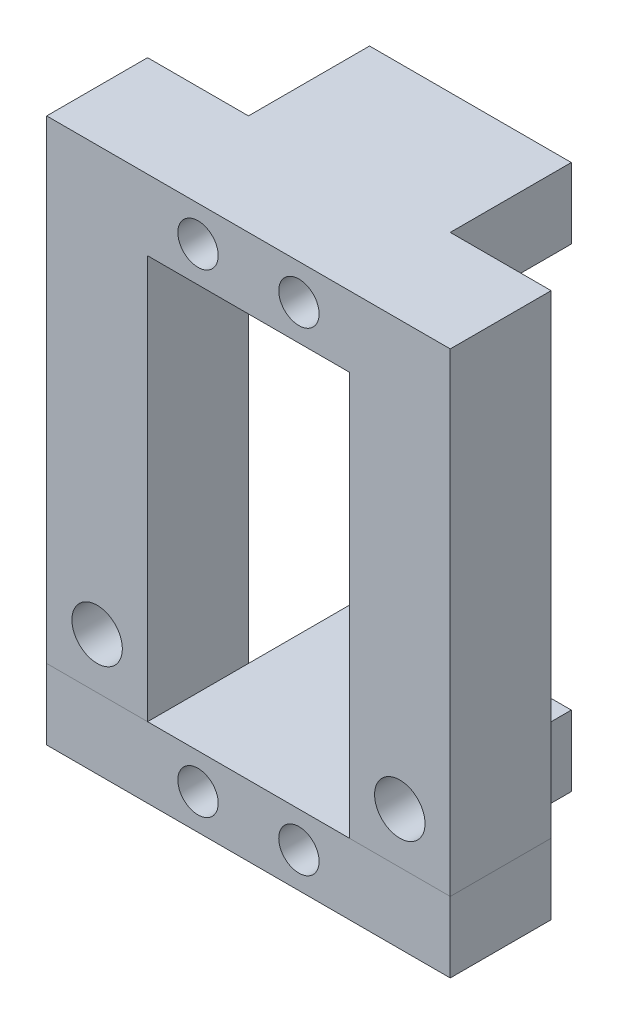
ISO-10303-21;
HEADER;
FILE_DESCRIPTION(('STEP AP214'),'2;1');
FILE_NAME('part.step','',(''),(''),'','','');
FILE_SCHEMA(('AUTOMOTIVE_DESIGN { 1 0 10303 214 1 1 1 1 }'));
ENDSEC;
DATA;
#1=APPLICATION_CONTEXT('core data for automotive mechanical design processes');
#2=APPLICATION_PROTOCOL_DEFINITION('international standard','automotive_design',2000,#1);
#3=PRODUCT_CONTEXT('',#1,'mechanical');
#4=PRODUCT('Part','Part','',(#3));
#5=PRODUCT_RELATED_PRODUCT_CATEGORY('part','',(#4));
#6=PRODUCT_DEFINITION_FORMATION('','',#4);
#7=PRODUCT_DEFINITION_CONTEXT('part definition',#1,'design');
#8=PRODUCT_DEFINITION('design','',#6,#7);
#9=PRODUCT_DEFINITION_SHAPE('','',#8);
#10=(LENGTH_UNIT() NAMED_UNIT(*) SI_UNIT(.MILLI.,.METRE.));
#11=(NAMED_UNIT(*) PLANE_ANGLE_UNIT() SI_UNIT($,.RADIAN.));
#12=(NAMED_UNIT(*) SI_UNIT($,.STERADIAN.) SOLID_ANGLE_UNIT());
#13=UNCERTAINTY_MEASURE_WITH_UNIT(LENGTH_MEASURE(1.E-05),#10,'distance_accuracy_value','');
#14=(GEOMETRIC_REPRESENTATION_CONTEXT(3) GLOBAL_UNCERTAINTY_ASSIGNED_CONTEXT((#13)) GLOBAL_UNIT_ASSIGNED_CONTEXT((#10,
#11,#12)) REPRESENTATION_CONTEXT('',''));
#15=CARTESIAN_POINT('',(0.,0.,0.));
#16=DIRECTION('',(0.,0.,1.));
#17=DIRECTION('',(1.,0.,0.));
#18=AXIS2_PLACEMENT_3D('',#15,#16,#17);
#19=CARTESIAN_POINT('',(0.,0.,0.));
#20=DIRECTION('',(0.,0.,1.));
#21=DIRECTION('',(1.,0.,0.));
#22=AXIS2_PLACEMENT_3D('',#19,#20,#21);
#23=PLANE('',#22);
#24=DIRECTION('',(0.,-1.,0.));
#25=VECTOR('',#24,1.);
#26=CARTESIAN_POINT('',(9.99999999999927,-4.99999999999999,0.));
#27=LINE('',#26,#25);
#28=CARTESIAN_POINT('',(9.99999999999927,-4.99999999999999,0.));
#29=VERTEX_POINT('',#28);
#30=CARTESIAN_POINT('',(9.99999999999927,-12.,0.));
#31=VERTEX_POINT('',#30);
#32=EDGE_CURVE('E132',#29,#31,#27,.T.);
#33=ORIENTED_EDGE('',*,*,#32,.F.);
#34=DIRECTION('',(-1.,0.,0.));
#35=VECTOR('',#34,1.);
#36=CARTESIAN_POINT('',(-20.,-5.,0.));
#37=LINE('',#36,#35);
#38=CARTESIAN_POINT('',(20.,-4.99999999999999,0.));
#39=VERTEX_POINT('',#38);
#40=EDGE_CURVE('E242',#39,#29,#37,.T.);
#41=ORIENTED_EDGE('',*,*,#40,.F.);
#42=DIRECTION('',(0.,1.,0.));
#43=VECTOR('',#42,1.);
#44=CARTESIAN_POINT('',(20.,-4.99999999999999,0.));
#45=LINE('',#44,#43);
#46=CARTESIAN_POINT('',(20.,-12.,0.));
#47=VERTEX_POINT('',#46);
#48=EDGE_CURVE('E232',#47,#39,#45,.T.);
#49=ORIENTED_EDGE('',*,*,#48,.F.);
#50=DIRECTION('',(1.,0.,0.));
#51=VECTOR('',#50,1.);
#52=CARTESIAN_POINT('',(-20.,-12.,0.));
#53=LINE('',#52,#51);
#54=EDGE_CURVE('E61',#31,#47,#53,.T.);
#55=ORIENTED_EDGE('',*,*,#54,.F.);
#56=EDGE_LOOP('',(#33,#41,#49,#55));
#57=FACE_BOUND('',#56,.T.);
#58=ADVANCED_FACE('F44',(#57),#23,.F.);
#59=DIRECTION('',(0.,1.,0.));
#60=VECTOR('',#59,1.);
#61=CARTESIAN_POINT('',(-10.,-4.99999999999999,0.));
#62=LINE('',#61,#60);
#63=CARTESIAN_POINT('',(-10.,-12.,0.));
#64=VERTEX_POINT('',#63);
#65=CARTESIAN_POINT('',(-10.,-4.99999999999999,0.));
#66=VERTEX_POINT('',#65);
#67=EDGE_CURVE('E69',#64,#66,#62,.T.);
#68=ORIENTED_EDGE('',*,*,#67,.F.);
#69=CARTESIAN_POINT('',(-20.,-12.,0.));
#70=VERTEX_POINT('',#69);
#71=EDGE_CURVE('E231',#70,#64,#53,.T.);
#72=ORIENTED_EDGE('',*,*,#71,.F.);
#73=DIRECTION('',(0.,-1.,0.));
#74=VECTOR('',#73,1.);
#75=CARTESIAN_POINT('',(-20.,-5.,0.));
#76=LINE('',#75,#74);
#77=CARTESIAN_POINT('',(-20.,-5.,0.));
#78=VERTEX_POINT('',#77);
#79=EDGE_CURVE('E133',#78,#70,#76,.T.);
#80=ORIENTED_EDGE('',*,*,#79,.F.);
#81=EDGE_CURVE('E230',#66,#78,#37,.T.);
#82=ORIENTED_EDGE('',*,*,#81,.F.);
#83=EDGE_LOOP('',(#68,#72,#80,#82));
#84=FACE_BOUND('',#83,.T.);
#85=ADVANCED_FACE('F201',(#84),#23,.F.);
#86=CARTESIAN_POINT('',(-20.,-5.,10.));
#87=DIRECTION('',(1.,0.,0.));
#88=DIRECTION('',(0.,0.,-1.));
#89=AXIS2_PLACEMENT_3D('',#86,#87,#88);
#90=PLANE('',#89);
#91=ORIENTED_EDGE('',*,*,#79,.T.);
#92=DIRECTION('',(0.,0.,-1.));
#93=VECTOR('',#92,1.);
#94=CARTESIAN_POINT('',(-20.,-12.,10.));
#95=LINE('',#94,#93);
#96=CARTESIAN_POINT('',(-20.,-12.,10.));
#97=VERTEX_POINT('',#96);
#98=EDGE_CURVE('E12',#97,#70,#95,.T.);
#99=ORIENTED_EDGE('',*,*,#98,.F.);
#100=DIRECTION('',(0.,-1.,0.));
#101=VECTOR('',#100,1.);
#102=CARTESIAN_POINT('',(-20.,-5.,10.));
#103=LINE('',#102,#101);
#104=CARTESIAN_POINT('',(-20.,-5.,10.));
#105=VERTEX_POINT('',#104);
#106=EDGE_CURVE('E153',#105,#97,#103,.T.);
#107=ORIENTED_EDGE('',*,*,#106,.F.);
#108=DIRECTION('',(0.,0.,-1.));
#109=VECTOR('',#108,1.);
#110=CARTESIAN_POINT('',(-20.,-5.,10.));
#111=LINE('',#110,#109);
#112=EDGE_CURVE('E229',#105,#78,#111,.T.);
#113=ORIENTED_EDGE('',*,*,#112,.T.);
#114=EDGE_LOOP('',(#91,#99,#107,#113));
#115=FACE_BOUND('',#114,.T.);
#116=ADVANCED_FACE('F46',(#115),#90,.F.);
#117=CARTESIAN_POINT('',(-20.,-12.,10.));
#118=DIRECTION('',(0.,1.,0.));
#119=DIRECTION('',(0.,0.,1.));
#120=AXIS2_PLACEMENT_3D('',#117,#118,#119);
#121=PLANE('',#120);
#122=ORIENTED_EDGE('',*,*,#71,.T.);
#123=DIRECTION('',(0.,0.,1.));
#124=VECTOR('',#123,1.);
#125=CARTESIAN_POINT('',(-10.,-12.,-12.));
#126=LINE('',#125,#124);
#127=CARTESIAN_POINT('',(-10.,-12.,-12.));
#128=VERTEX_POINT('',#127);
#129=EDGE_CURVE('E117',#128,#64,#126,.T.);
#130=ORIENTED_EDGE('',*,*,#129,.F.);
#131=DIRECTION('',(-1.,0.,0.));
#132=VECTOR('',#131,1.);
#133=CARTESIAN_POINT('',(9.99999999999927,-12.,-12.));
#134=LINE('',#133,#132);
#135=CARTESIAN_POINT('',(9.99999999999927,-12.,-12.));
#136=VERTEX_POINT('',#135);
#137=EDGE_CURVE('E110',#136,#128,#134,.T.);
#138=ORIENTED_EDGE('',*,*,#137,.F.);
#139=DIRECTION('',(0.,0.,1.));
#140=VECTOR('',#139,1.);
#141=CARTESIAN_POINT('',(9.99999999999927,-12.,-12.));
#142=LINE('',#141,#140);
#143=EDGE_CURVE('E114',#136,#31,#142,.T.);
#144=ORIENTED_EDGE('',*,*,#143,.T.);
#145=ORIENTED_EDGE('',*,*,#54,.T.);
#146=DIRECTION('',(0.,0.,-1.));
#147=VECTOR('',#146,1.);
#148=CARTESIAN_POINT('',(20.,-12.,10.));
#149=LINE('',#148,#147);
#150=CARTESIAN_POINT('',(20.,-12.,10.));
#151=VERTEX_POINT('',#150);
#152=EDGE_CURVE('E53',#151,#47,#149,.T.);
#153=ORIENTED_EDGE('',*,*,#152,.F.);
#154=DIRECTION('',(1.,0.,0.));
#155=VECTOR('',#154,1.);
#156=CARTESIAN_POINT('',(-20.,-12.,10.));
#157=LINE('',#156,#155);
#158=EDGE_CURVE('E234',#97,#151,#157,.T.);
#159=ORIENTED_EDGE('',*,*,#158,.F.);
#160=ORIENTED_EDGE('',*,*,#98,.T.);
#161=EDGE_LOOP('',(#122,#130,#138,#144,#145,#153,#159,#160));
#162=FACE_BOUND('',#161,.T.);
#163=ADVANCED_FACE('F112',(#162),#121,.F.);
#164=CARTESIAN_POINT('',(20.,-4.99999999999999,10.));
#165=DIRECTION('',(-1.,0.,0.));
#166=DIRECTION('',(0.,0.,1.));
#167=AXIS2_PLACEMENT_3D('',#164,#165,#166);
#168=PLANE('',#167);
#169=ORIENTED_EDGE('',*,*,#48,.T.);
#170=DIRECTION('',(0.,0.,-1.));
#171=VECTOR('',#170,1.);
#172=CARTESIAN_POINT('',(20.,-4.99999999999999,10.));
#173=LINE('',#172,#171);
#174=CARTESIAN_POINT('',(20.,-4.99999999999999,10.));
#175=VERTEX_POINT('',#174);
#176=EDGE_CURVE('E255',#175,#39,#173,.T.);
#177=ORIENTED_EDGE('',*,*,#176,.F.);
#178=DIRECTION('',(0.,1.,0.));
#179=VECTOR('',#178,1.);
#180=CARTESIAN_POINT('',(20.,-4.99999999999999,10.));
#181=LINE('',#180,#179);
#182=EDGE_CURVE('E239',#151,#175,#181,.T.);
#183=ORIENTED_EDGE('',*,*,#182,.F.);
#184=ORIENTED_EDGE('',*,*,#152,.T.);
#185=EDGE_LOOP('',(#169,#177,#183,#184));
#186=FACE_BOUND('',#185,.T.);
#187=ADVANCED_FACE('F213',(#186),#168,.F.);
#188=CARTESIAN_POINT('',(-20.,-5.,10.));
#189=DIRECTION('',(0.,-1.,0.));
#190=DIRECTION('',(1.,0.,0.));
#191=AXIS2_PLACEMENT_3D('',#188,#189,#190);
#192=PLANE('',#191);
#193=ORIENTED_EDGE('',*,*,#40,.T.);
#194=DIRECTION('',(0.,0.,1.));
#195=VECTOR('',#194,1.);
#196=CARTESIAN_POINT('',(9.99999999999927,-4.99999999999999,-12.));
#197=LINE('',#196,#195);
#198=CARTESIAN_POINT('',(9.99999999999927,-4.99999999999999,-12.));
#199=VERTEX_POINT('',#198);
#200=EDGE_CURVE('E146',#199,#29,#197,.T.);
#201=ORIENTED_EDGE('',*,*,#200,.F.);
#202=DIRECTION('',(1.,0.,0.));
#203=VECTOR('',#202,1.);
#204=CARTESIAN_POINT('',(9.99999999999927,-4.99999999999999,-12.));
#205=LINE('',#204,#203);
#206=CARTESIAN_POINT('',(-10.,-4.99999999999999,-12.));
#207=VERTEX_POINT('',#206);
#208=EDGE_CURVE('E126',#207,#199,#205,.T.);
#209=ORIENTED_EDGE('',*,*,#208,.F.);
#210=DIRECTION('',(0.,0.,1.));
#211=VECTOR('',#210,1.);
#212=CARTESIAN_POINT('',(-10.,-4.99999999999999,-12.));
#213=LINE('',#212,#211);
#214=EDGE_CURVE('E137',#207,#66,#213,.T.);
#215=ORIENTED_EDGE('',*,*,#214,.T.);
#216=ORIENTED_EDGE('',*,*,#81,.T.);
#217=ORIENTED_EDGE('',*,*,#112,.F.);
#218=DIRECTION('',(-1.,0.,0.));
#219=VECTOR('',#218,1.);
#220=CARTESIAN_POINT('',(-20.,-5.,10.));
#221=LINE('',#220,#219);
#222=EDGE_CURVE('E241',#175,#105,#221,.T.);
#223=ORIENTED_EDGE('',*,*,#222,.F.);
#224=ORIENTED_EDGE('',*,*,#176,.T.);
#225=EDGE_LOOP('',(#193,#201,#209,#215,#216,#217,#223,#224));
#226=FACE_BOUND('',#225,.T.);
#227=ADVANCED_FACE('F210',(#226),#192,.F.);
#228=CARTESIAN_POINT('',(0.,0.,10.));
#229=DIRECTION('',(0.,0.,1.));
#230=DIRECTION('',(1.,0.,0.));
#231=AXIS2_PLACEMENT_3D('',#228,#229,#230);
#232=PLANE('',#231);
#233=CARTESIAN_POINT('',(-5.00000000000065,-8.50000000000036,10.));
#234=DIRECTION('',(0.,0.,-1.));
#235=DIRECTION('',(-1.,0.,0.));
#236=AXIS2_PLACEMENT_3D('',#233,#234,#235);
#237=CIRCLE('',#236,2.);
#238=CARTESIAN_POINT('',(-7.00000000000065,-8.50000000000036,10.));
#239=VERTEX_POINT('',#238);
#240=EDGE_CURVE('E169',#239,#239,#237,.T.);
#241=ORIENTED_EDGE('',*,*,#240,.T.);
#242=EDGE_LOOP('',(#241));
#243=FACE_BOUND('',#242,.T.);
#244=CARTESIAN_POINT('',(4.99999999999935,-8.50000000000036,10.));
#245=DIRECTION('',(0.,0.,-1.));
#246=DIRECTION('',(-1.,0.,0.));
#247=AXIS2_PLACEMENT_3D('',#244,#245,#246);
#248=CIRCLE('',#247,2.);
#249=CARTESIAN_POINT('',(2.99999999999935,-8.50000000000036,10.));
#250=VERTEX_POINT('',#249);
#251=EDGE_CURVE('E145',#250,#250,#248,.T.);
#252=ORIENTED_EDGE('',*,*,#251,.T.);
#253=EDGE_LOOP('',(#252));
#254=FACE_BOUND('',#253,.T.);
#255=ORIENTED_EDGE('',*,*,#106,.T.);
#256=ORIENTED_EDGE('',*,*,#158,.T.);
#257=ORIENTED_EDGE('',*,*,#182,.T.);
#258=ORIENTED_EDGE('',*,*,#222,.T.);
#259=EDGE_LOOP('',(#255,#256,#257,#258));
#260=FACE_BOUND('',#259,.T.);
#261=ADVANCED_FACE('F178',(#243,#254,#260),#232,.T.);
#262=CARTESIAN_POINT('',(9.99999999999927,-4.99999999999999,-12.));
#263=DIRECTION('',(-1.,0.,0.));
#264=DIRECTION('',(0.,-1.,0.));
#265=AXIS2_PLACEMENT_3D('',#262,#263,#264);
#266=PLANE('',#265);
#267=ORIENTED_EDGE('',*,*,#32,.T.);
#268=ORIENTED_EDGE('',*,*,#143,.F.);
#269=DIRECTION('',(0.,-1.,0.));
#270=VECTOR('',#269,1.);
#271=CARTESIAN_POINT('',(9.99999999999927,-4.99999999999999,-12.));
#272=LINE('',#271,#270);
#273=EDGE_CURVE('E121',#199,#136,#272,.T.);
#274=ORIENTED_EDGE('',*,*,#273,.F.);
#275=ORIENTED_EDGE('',*,*,#200,.T.);
#276=EDGE_LOOP('',(#267,#268,#274,#275));
#277=FACE_BOUND('',#276,.T.);
#278=ADVANCED_FACE('F131',(#277),#266,.F.);
#279=CARTESIAN_POINT('',(-10.,-4.99999999999999,-12.));
#280=DIRECTION('',(1.,0.,0.));
#281=DIRECTION('',(0.,1.,0.));
#282=AXIS2_PLACEMENT_3D('',#279,#280,#281);
#283=PLANE('',#282);
#284=ORIENTED_EDGE('',*,*,#67,.T.);
#285=ORIENTED_EDGE('',*,*,#214,.F.);
#286=DIRECTION('',(0.,1.,0.));
#287=VECTOR('',#286,1.);
#288=CARTESIAN_POINT('',(-10.,-4.99999999999999,-12.));
#289=LINE('',#288,#287);
#290=EDGE_CURVE('E120',#128,#207,#289,.T.);
#291=ORIENTED_EDGE('',*,*,#290,.F.);
#292=ORIENTED_EDGE('',*,*,#129,.T.);
#293=EDGE_LOOP('',(#284,#285,#291,#292));
#294=FACE_BOUND('',#293,.T.);
#295=ADVANCED_FACE('F190',(#294),#283,.F.);
#296=CARTESIAN_POINT('',(0.,0.,-12.));
#297=DIRECTION('',(0.,0.,-1.));
#298=DIRECTION('',(-1.,0.,0.));
#299=AXIS2_PLACEMENT_3D('',#296,#297,#298);
#300=PLANE('',#299);
#301=CARTESIAN_POINT('',(-5.00000000000065,-8.50000000000036,-12.));
#302=DIRECTION('',(0.,0.,-1.));
#303=DIRECTION('',(-1.,0.,0.));
#304=AXIS2_PLACEMENT_3D('',#301,#302,#303);
#305=CIRCLE('',#304,2.);
#306=CARTESIAN_POINT('',(-7.00000000000065,-8.50000000000036,-12.));
#307=VERTEX_POINT('',#306);
#308=EDGE_CURVE('E172',#307,#307,#305,.T.);
#309=ORIENTED_EDGE('',*,*,#308,.F.);
#310=EDGE_LOOP('',(#309));
#311=FACE_BOUND('',#310,.T.);
#312=CARTESIAN_POINT('',(4.99999999999935,-8.50000000000036,-12.));
#313=DIRECTION('',(0.,0.,-1.));
#314=DIRECTION('',(-1.,0.,0.));
#315=AXIS2_PLACEMENT_3D('',#312,#313,#314);
#316=CIRCLE('',#315,2.);
#317=CARTESIAN_POINT('',(2.99999999999935,-8.50000000000036,-12.));
#318=VERTEX_POINT('',#317);
#319=EDGE_CURVE('E166',#318,#318,#316,.T.);
#320=ORIENTED_EDGE('',*,*,#319,.F.);
#321=EDGE_LOOP('',(#320));
#322=FACE_BOUND('',#321,.T.);
#323=ORIENTED_EDGE('',*,*,#273,.T.);
#324=ORIENTED_EDGE('',*,*,#137,.T.);
#325=ORIENTED_EDGE('',*,*,#290,.T.);
#326=ORIENTED_EDGE('',*,*,#208,.T.);
#327=EDGE_LOOP('',(#323,#324,#325,#326));
#328=FACE_BOUND('',#327,.T.);
#329=ADVANCED_FACE('F124',(#311,#322,#328),#300,.T.);
#330=CARTESIAN_POINT('',(4.99999999999935,-8.50000000000036,10.));
#331=DIRECTION('',(0.,0.,-1.));
#332=DIRECTION('',(-1.,0.,0.));
#333=AXIS2_PLACEMENT_3D('',#330,#331,#332);
#334=CYLINDRICAL_SURFACE('',#333,2.);
#335=ORIENTED_EDGE('',*,*,#251,.F.);
#336=EDGE_LOOP('',(#335));
#337=FACE_BOUND('',#336,.T.);
#338=ORIENTED_EDGE('',*,*,#319,.T.);
#339=EDGE_LOOP('',(#338));
#340=FACE_BOUND('',#339,.T.);
#341=ADVANCED_FACE('F184',(#337,#340),#334,.F.);
#342=CARTESIAN_POINT('',(-5.00000000000065,-8.50000000000036,10.));
#343=DIRECTION('',(0.,0.,-1.));
#344=DIRECTION('',(-1.,0.,0.));
#345=AXIS2_PLACEMENT_3D('',#342,#343,#344);
#346=CYLINDRICAL_SURFACE('',#345,2.);
#347=ORIENTED_EDGE('',*,*,#240,.F.);
#348=EDGE_LOOP('',(#347));
#349=FACE_BOUND('',#348,.T.);
#350=ORIENTED_EDGE('',*,*,#308,.T.);
#351=EDGE_LOOP('',(#350));
#352=FACE_BOUND('',#351,.T.);
#353=ADVANCED_FACE('F181',(#349,#352),#346,.F.);
#354=CLOSED_SHELL('',(#58,#85,#116,#163,#187,#227,#261,#278,#295,#329,#341,#353));
#355=MANIFOLD_SOLID_BREP('B2',#354);
#356=CARTESIAN_POINT('',(0.,34.9999999999997,-1.2411675704743E-13));
#357=DIRECTION('',(0.,1.,0.));
#358=DIRECTION('',(0.,0.,1.));
#359=AXIS2_PLACEMENT_3D('',#356,#357,#358);
#360=PLANE('',#359);
#361=DIRECTION('',(0.,0.,1.));
#362=VECTOR('',#361,1.);
#363=CARTESIAN_POINT('',(10.,34.9999999999997,0.));
#364=LINE('',#363,#362);
#365=CARTESIAN_POINT('',(10.,34.9999999999997,0.));
#366=VERTEX_POINT('',#365);
#367=CARTESIAN_POINT('',(10.,34.9999999999997,10.));
#368=VERTEX_POINT('',#367);
#369=EDGE_CURVE('E428',#366,#368,#364,.T.);
#370=ORIENTED_EDGE('',*,*,#369,.T.);
#371=DIRECTION('',(1.,0.,0.));
#372=VECTOR('',#371,1.);
#373=CARTESIAN_POINT('',(0.,34.9999999999997,10.));
#374=LINE('',#373,#372);
#375=CARTESIAN_POINT('',(-10.,34.9999999999997,10.));
#376=VERTEX_POINT('',#375);
#377=EDGE_CURVE('E441',#376,#368,#374,.T.);
#378=ORIENTED_EDGE('',*,*,#377,.F.);
#379=DIRECTION('',(0.,0.,-1.));
#380=VECTOR('',#379,1.);
#381=CARTESIAN_POINT('',(-10.,34.9999999999997,0.));
#382=LINE('',#381,#380);
#383=CARTESIAN_POINT('',(-10.,34.9999999999997,0.));
#384=VERTEX_POINT('',#383);
#385=EDGE_CURVE('E483',#376,#384,#382,.T.);
#386=ORIENTED_EDGE('',*,*,#385,.T.);
#387=DIRECTION('',(0.,0.,1.));
#388=VECTOR('',#387,1.);
#389=CARTESIAN_POINT('',(-10.,34.9999999999997,-1.2411675704743E-13));
#390=LINE('',#389,#388);
#391=CARTESIAN_POINT('',(-10.,34.9999999999996,-12.0000000000001));
#392=VERTEX_POINT('',#391);
#393=EDGE_CURVE('E451',#392,#384,#390,.T.);
#394=ORIENTED_EDGE('',*,*,#393,.F.);
#395=DIRECTION('',(1.,0.,0.));
#396=VECTOR('',#395,1.);
#397=CARTESIAN_POINT('',(0.,34.9999999999996,-12.0000000000001));
#398=LINE('',#397,#396);
#399=CARTESIAN_POINT('',(9.99999999999927,34.9999999999996,-12.0000000000001));
#400=VERTEX_POINT('',#399);
#401=EDGE_CURVE('E457',#392,#400,#398,.T.);
#402=ORIENTED_EDGE('',*,*,#401,.T.);
#403=DIRECTION('',(0.,0.,1.));
#404=VECTOR('',#403,1.);
#405=CARTESIAN_POINT('',(9.99999999999927,34.9999999999997,-1.2411675704743E-13));
#406=LINE('',#405,#404);
#407=EDGE_CURVE('E444',#400,#366,#406,.T.);
#408=ORIENTED_EDGE('',*,*,#407,.T.);
#409=EDGE_LOOP('',(#370,#378,#386,#394,#402,#408));
#410=FACE_BOUND('',#409,.T.);
#411=ADVANCED_FACE('F337',(#410),#360,.F.);
#412=CARTESIAN_POINT('',(-10.,0.,10.));
#413=DIRECTION('',(1.,0.,0.));
#414=DIRECTION('',(0.,1.,0.));
#415=AXIS2_PLACEMENT_3D('',#412,#413,#414);
#416=PLANE('',#415);
#417=DIRECTION('',(0.,-1.,0.));
#418=VECTOR('',#417,1.);
#419=CARTESIAN_POINT('',(-10.,0.,0.));
#420=LINE('',#419,#418);
#421=CARTESIAN_POINT('',(-9.99999999999999,-5.,0.));
#422=VERTEX_POINT('',#421);
#423=EDGE_CURVE('E489',#384,#422,#420,.T.);
#424=ORIENTED_EDGE('',*,*,#423,.F.);
#425=ORIENTED_EDGE('',*,*,#385,.F.);
#426=DIRECTION('',(0.,-1.,0.));
#427=VECTOR('',#426,1.);
#428=CARTESIAN_POINT('',(-10.,0.,10.));
#429=LINE('',#428,#427);
#430=CARTESIAN_POINT('',(-9.99999999999999,-5.,10.));
#431=VERTEX_POINT('',#430);
#432=EDGE_CURVE('E372',#376,#431,#429,.T.);
#433=ORIENTED_EDGE('',*,*,#432,.T.);
#434=DIRECTION('',(0.,0.,-1.));
#435=VECTOR('',#434,1.);
#436=CARTESIAN_POINT('',(-9.99999999999999,-5.,10.));
#437=LINE('',#436,#435);
#438=EDGE_CURVE('E347',#431,#422,#437,.T.);
#439=ORIENTED_EDGE('',*,*,#438,.T.);
#440=EDGE_LOOP('',(#424,#425,#433,#439));
#441=FACE_BOUND('',#440,.T.);
#442=ADVANCED_FACE('F513',(#441),#416,.T.);
#443=CARTESIAN_POINT('',(-20.,0.,10.));
#444=DIRECTION('',(1.,0.,0.));
#445=DIRECTION('',(0.,1.,0.));
#446=AXIS2_PLACEMENT_3D('',#443,#444,#445);
#447=PLANE('',#446);
#448=DIRECTION('',(0.,-1.,0.));
#449=VECTOR('',#448,1.);
#450=CARTESIAN_POINT('',(-20.,0.,0.));
#451=LINE('',#450,#449);
#452=CARTESIAN_POINT('',(-20.,41.9999999999997,0.));
#453=VERTEX_POINT('',#452);
#454=CARTESIAN_POINT('',(-20.,-5.,0.));
#455=VERTEX_POINT('',#454);
#456=EDGE_CURVE('E498',#453,#455,#451,.T.);
#457=ORIENTED_EDGE('',*,*,#456,.T.);
#458=DIRECTION('',(0.,0.,-1.));
#459=VECTOR('',#458,1.);
#460=CARTESIAN_POINT('',(-20.,-5.,10.));
#461=LINE('',#460,#459);
#462=CARTESIAN_POINT('',(-20.,-5.,10.));
#463=VERTEX_POINT('',#462);
#464=EDGE_CURVE('E42',#463,#455,#461,.T.);
#465=ORIENTED_EDGE('',*,*,#464,.F.);
#466=DIRECTION('',(0.,-1.,0.));
#467=VECTOR('',#466,1.);
#468=CARTESIAN_POINT('',(-20.,0.,10.));
#469=LINE('',#468,#467);
#470=CARTESIAN_POINT('',(-20.,41.9999999999997,9.99999999999998));
#471=VERTEX_POINT('',#470);
#472=EDGE_CURVE('E494',#471,#463,#469,.T.);
#473=ORIENTED_EDGE('',*,*,#472,.F.);
#474=DIRECTION('',(0.,0.,1.));
#475=VECTOR('',#474,1.);
#476=CARTESIAN_POINT('',(-20.,41.9999999999997,-1.48557126419332E-13));
#477=LINE('',#476,#475);
#478=EDGE_CURVE('E527',#453,#471,#477,.T.);
#479=ORIENTED_EDGE('',*,*,#478,.F.);
#480=EDGE_LOOP('',(#457,#465,#473,#479));
#481=FACE_BOUND('',#480,.T.);
#482=ADVANCED_FACE('F509',(#481),#447,.F.);
#483=CARTESIAN_POINT('',(-15.,0.,10.));
#484=DIRECTION('',(0.,0.,-1.));
#485=DIRECTION('',(-1.,0.,0.));
#486=AXIS2_PLACEMENT_3D('',#483,#484,#485);
#487=CYLINDRICAL_SURFACE('',#486,2.5);
#488=CARTESIAN_POINT('',(-15.,0.,10.));
#489=DIRECTION('',(0.,0.,1.));
#490=DIRECTION('',(1.,0.,0.));
#491=AXIS2_PLACEMENT_3D('',#488,#489,#490);
#492=CIRCLE('',#491,2.5);
#493=CARTESIAN_POINT('',(-12.5,0.,10.));
#494=VERTEX_POINT('',#493);
#495=EDGE_CURVE('E464',#494,#494,#492,.T.);
#496=ORIENTED_EDGE('',*,*,#495,.T.);
#497=EDGE_LOOP('',(#496));
#498=FACE_BOUND('',#497,.T.);
#499=CARTESIAN_POINT('',(-15.,0.,0.));
#500=DIRECTION('',(0.,0.,1.));
#501=DIRECTION('',(1.,0.,0.));
#502=AXIS2_PLACEMENT_3D('',#499,#500,#501);
#503=CIRCLE('',#502,2.5);
#504=CARTESIAN_POINT('',(-12.5,0.,0.));
#505=VERTEX_POINT('',#504);
#506=EDGE_CURVE('E487',#505,#505,#503,.T.);
#507=ORIENTED_EDGE('',*,*,#506,.F.);
#508=EDGE_LOOP('',(#507));
#509=FACE_BOUND('',#508,.T.);
#510=ADVANCED_FACE('F339',(#498,#509),#487,.F.);
#511=CARTESIAN_POINT('',(0.,-5.,10.));
#512=DIRECTION('',(0.,1.,0.));
#513=DIRECTION('',(0.,0.,1.));
#514=AXIS2_PLACEMENT_3D('',#511,#512,#513);
#515=PLANE('',#514);
#516=DIRECTION('',(1.,0.,0.));
#517=VECTOR('',#516,1.);
#518=CARTESIAN_POINT('',(0.,-5.,0.));
#519=LINE('',#518,#517);
#520=EDGE_CURVE('E367',#455,#422,#519,.T.);
#521=ORIENTED_EDGE('',*,*,#520,.T.);
#522=ORIENTED_EDGE('',*,*,#438,.F.);
#523=DIRECTION('',(1.,0.,0.));
#524=VECTOR('',#523,1.);
#525=CARTESIAN_POINT('',(0.,-5.,10.));
#526=LINE('',#525,#524);
#527=EDGE_CURVE('E356',#463,#431,#526,.T.);
#528=ORIENTED_EDGE('',*,*,#527,.F.);
#529=ORIENTED_EDGE('',*,*,#464,.T.);
#530=EDGE_LOOP('',(#521,#522,#528,#529));
#531=FACE_BOUND('',#530,.T.);
#532=ADVANCED_FACE('F511',(#531),#515,.F.);
#533=CARTESIAN_POINT('',(0.,0.,10.));
#534=DIRECTION('',(0.,0.,1.));
#535=DIRECTION('',(1.,0.,0.));
#536=AXIS2_PLACEMENT_3D('',#533,#534,#535);
#537=PLANE('',#536);
#538=CARTESIAN_POINT('',(-5.00000000000066,38.4999999999997,10.));
#539=DIRECTION('',(0.,0.,1.));
#540=DIRECTION('',(1.,0.,0.));
#541=AXIS2_PLACEMENT_3D('',#538,#539,#540);
#542=CIRCLE('',#541,2.);
#543=CARTESIAN_POINT('',(-3.00000000000066,38.4999999999997,10.));
#544=VERTEX_POINT('',#543);
#545=EDGE_CURVE('E552',#544,#544,#542,.T.);
#546=ORIENTED_EDGE('',*,*,#545,.F.);
#547=EDGE_LOOP('',(#546));
#548=FACE_BOUND('',#547,.T.);
#549=CARTESIAN_POINT('',(4.99999999999934,38.4999999999997,10.));
#550=DIRECTION('',(0.,0.,1.));
#551=DIRECTION('',(1.,0.,0.));
#552=AXIS2_PLACEMENT_3D('',#549,#550,#551);
#553=CIRCLE('',#552,2.);
#554=CARTESIAN_POINT('',(6.99999999999934,38.4999999999997,10.));
#555=VERTEX_POINT('',#554);
#556=EDGE_CURVE('E446',#555,#555,#553,.T.);
#557=ORIENTED_EDGE('',*,*,#556,.F.);
#558=EDGE_LOOP('',(#557));
#559=FACE_BOUND('',#558,.T.);
#560=ORIENTED_EDGE('',*,*,#495,.F.);
#561=EDGE_LOOP('',(#560));
#562=FACE_BOUND('',#561,.T.);
#563=ORIENTED_EDGE('',*,*,#432,.F.);
#564=ORIENTED_EDGE('',*,*,#377,.T.);
#565=DIRECTION('',(0.,-1.,0.));
#566=VECTOR('',#565,1.);
#567=CARTESIAN_POINT('',(10.,0.,10.));
#568=LINE('',#567,#566);
#569=CARTESIAN_POINT('',(10.,-4.99999999999999,10.));
#570=VERTEX_POINT('',#569);
#571=EDGE_CURVE('E425',#368,#570,#568,.T.);
#572=ORIENTED_EDGE('',*,*,#571,.T.);
#573=DIRECTION('',(1.,0.,0.));
#574=VECTOR('',#573,1.);
#575=CARTESIAN_POINT('',(0.,-4.99999999999999,10.));
#576=LINE('',#575,#574);
#577=CARTESIAN_POINT('',(20.,-4.99999999999999,10.));
#578=VERTEX_POINT('',#577);
#579=EDGE_CURVE('E434',#570,#578,#576,.T.);
#580=ORIENTED_EDGE('',*,*,#579,.T.);
#581=DIRECTION('',(0.,-1.,0.));
#582=VECTOR('',#581,1.);
#583=CARTESIAN_POINT('',(20.,41.9999999999997,9.99999999999998));
#584=LINE('',#583,#582);
#585=CARTESIAN_POINT('',(20.,41.9999999999997,9.99999999999998));
#586=VERTEX_POINT('',#585);
#587=EDGE_CURVE('E475',#586,#578,#584,.T.);
#588=ORIENTED_EDGE('',*,*,#587,.F.);
#589=DIRECTION('',(1.,0.,0.));
#590=VECTOR('',#589,1.);
#591=CARTESIAN_POINT('',(0.,41.9999999999997,9.99999999999998));
#592=LINE('',#591,#590);
#593=EDGE_CURVE('E505',#471,#586,#592,.T.);
#594=ORIENTED_EDGE('',*,*,#593,.F.);
#595=ORIENTED_EDGE('',*,*,#472,.T.);
#596=ORIENTED_EDGE('',*,*,#527,.T.);
#597=EDGE_LOOP('',(#563,#564,#572,#580,#588,#594,#595,#596));
#598=FACE_BOUND('',#597,.T.);
#599=CARTESIAN_POINT('',(15.,0.,10.));
#600=DIRECTION('',(0.,0.,1.));
#601=DIRECTION('',(1.,0.,0.));
#602=AXIS2_PLACEMENT_3D('',#599,#600,#601);
#603=CIRCLE('',#602,2.5);
#604=CARTESIAN_POINT('',(17.5,0.,10.));
#605=VERTEX_POINT('',#604);
#606=EDGE_CURVE('E537',#605,#605,#603,.F.);
#607=ORIENTED_EDGE('',*,*,#606,.T.);
#608=EDGE_LOOP('',(#607));
#609=FACE_BOUND('',#608,.T.);
#610=ADVANCED_FACE('F448',(#548,#559,#562,#598,#609),#537,.T.);
#611=CARTESIAN_POINT('',(0.,0.,0.));
#612=DIRECTION('',(0.,0.,1.));
#613=DIRECTION('',(1.,0.,0.));
#614=AXIS2_PLACEMENT_3D('',#611,#612,#613);
#615=PLANE('',#614);
#616=ORIENTED_EDGE('',*,*,#506,.T.);
#617=EDGE_LOOP('',(#616));
#618=FACE_BOUND('',#617,.T.);
#619=ORIENTED_EDGE('',*,*,#423,.T.);
#620=ORIENTED_EDGE('',*,*,#520,.F.);
#621=ORIENTED_EDGE('',*,*,#456,.F.);
#622=DIRECTION('',(1.,0.,0.));
#623=VECTOR('',#622,1.);
#624=CARTESIAN_POINT('',(0.,41.9999999999997,0.));
#625=LINE('',#624,#623);
#626=CARTESIAN_POINT('',(-10.,41.9999999999997,0.));
#627=VERTEX_POINT('',#626);
#628=EDGE_CURVE('E518',#453,#627,#625,.T.);
#629=ORIENTED_EDGE('',*,*,#628,.T.);
#630=DIRECTION('',(0.,-1.,0.));
#631=VECTOR('',#630,1.);
#632=CARTESIAN_POINT('',(-10.,41.9999999999997,0.));
#633=LINE('',#632,#631);
#634=EDGE_CURVE('E477',#627,#384,#633,.T.);
#635=ORIENTED_EDGE('',*,*,#634,.T.);
#636=EDGE_LOOP('',(#619,#620,#621,#629,#635));
#637=FACE_BOUND('',#636,.T.);
#638=ADVANCED_FACE('F514',(#618,#637),#615,.F.);
#639=CARTESIAN_POINT('',(9.99999999999927,41.9999999999997,-1.48557126419332E-13));
#640=DIRECTION('',(1.,0.,0.));
#641=DIRECTION('',(0.,1.,0.));
#642=AXIS2_PLACEMENT_3D('',#639,#640,#641);
#643=PLANE('',#642);
#644=ORIENTED_EDGE('',*,*,#407,.F.);
#645=DIRECTION('',(0.,-1.,0.));
#646=VECTOR('',#645,1.);
#647=CARTESIAN_POINT('',(9.99999999999927,41.9999999999996,-12.0000000000002));
#648=LINE('',#647,#646);
#649=CARTESIAN_POINT('',(9.99999999999927,41.9999999999996,-12.0000000000002));
#650=VERTEX_POINT('',#649);
#651=EDGE_CURVE('E462',#650,#400,#648,.T.);
#652=ORIENTED_EDGE('',*,*,#651,.F.);
#653=DIRECTION('',(0.,0.,1.));
#654=VECTOR('',#653,1.);
#655=CARTESIAN_POINT('',(9.99999999999927,41.9999999999997,-1.48557126419332E-13));
#656=LINE('',#655,#654);
#657=CARTESIAN_POINT('',(10.,41.9999999999997,0.));
#658=VERTEX_POINT('',#657);
#659=EDGE_CURVE('E450',#650,#658,#656,.T.);
#660=ORIENTED_EDGE('',*,*,#659,.T.);
#661=DIRECTION('',(0.,-1.,0.));
#662=VECTOR('',#661,1.);
#663=CARTESIAN_POINT('',(10.,41.9999999999997,0.));
#664=LINE('',#663,#662);
#665=EDGE_CURVE('E469',#658,#366,#664,.T.);
#666=ORIENTED_EDGE('',*,*,#665,.T.);
#667=EDGE_LOOP('',(#644,#652,#660,#666));
#668=FACE_BOUND('',#667,.T.);
#669=ADVANCED_FACE('F563',(#668),#643,.T.);
#670=CARTESIAN_POINT('',(0.,41.9999999999996,-12.0000000000002));
#671=DIRECTION('',(0.,0.,-1.));
#672=DIRECTION('',(0.,1.,0.));
#673=AXIS2_PLACEMENT_3D('',#670,#671,#672);
#674=PLANE('',#673);
#675=CARTESIAN_POINT('',(-5.00000000000066,38.4999999999996,-12.0000000000001));
#676=DIRECTION('',(0.,0.,-1.));
#677=DIRECTION('',(0.,1.,0.));
#678=AXIS2_PLACEMENT_3D('',#675,#676,#677);
#679=CIRCLE('',#678,2.);
#680=CARTESIAN_POINT('',(-5.00000000000066,40.4999999999996,-12.0000000000002));
#681=VERTEX_POINT('',#680);
#682=EDGE_CURVE('E555',#681,#681,#679,.T.);
#683=ORIENTED_EDGE('',*,*,#682,.F.);
#684=EDGE_LOOP('',(#683));
#685=FACE_BOUND('',#684,.T.);
#686=CARTESIAN_POINT('',(4.99999999999934,38.4999999999996,-12.0000000000001));
#687=DIRECTION('',(0.,0.,-1.));
#688=DIRECTION('',(0.,1.,0.));
#689=AXIS2_PLACEMENT_3D('',#686,#687,#688);
#690=CIRCLE('',#689,2.);
#691=CARTESIAN_POINT('',(4.99999999999934,40.4999999999996,-12.0000000000002));
#692=VERTEX_POINT('',#691);
#693=EDGE_CURVE('E549',#692,#692,#690,.T.);
#694=ORIENTED_EDGE('',*,*,#693,.F.);
#695=EDGE_LOOP('',(#694));
#696=FACE_BOUND('',#695,.T.);
#697=ORIENTED_EDGE('',*,*,#401,.F.);
#698=DIRECTION('',(0.,-1.,0.));
#699=VECTOR('',#698,1.);
#700=CARTESIAN_POINT('',(-10.,41.9999999999996,-12.0000000000002));
#701=LINE('',#700,#699);
#702=CARTESIAN_POINT('',(-10.,41.9999999999996,-12.0000000000002));
#703=VERTEX_POINT('',#702);
#704=EDGE_CURVE('E479',#703,#392,#701,.T.);
#705=ORIENTED_EDGE('',*,*,#704,.F.);
#706=DIRECTION('',(1.,0.,0.));
#707=VECTOR('',#706,1.);
#708=CARTESIAN_POINT('',(0.,41.9999999999996,-12.0000000000002));
#709=LINE('',#708,#707);
#710=EDGE_CURVE('E454',#703,#650,#709,.T.);
#711=ORIENTED_EDGE('',*,*,#710,.T.);
#712=ORIENTED_EDGE('',*,*,#651,.T.);
#713=EDGE_LOOP('',(#697,#705,#711,#712));
#714=FACE_BOUND('',#713,.T.);
#715=ADVANCED_FACE('F520',(#685,#696,#714),#674,.T.);
#716=CARTESIAN_POINT('',(-10.,41.9999999999997,-1.48557126419332E-13));
#717=DIRECTION('',(1.,0.,0.));
#718=DIRECTION('',(0.,1.,0.));
#719=AXIS2_PLACEMENT_3D('',#716,#717,#718);
#720=PLANE('',#719);
#721=ORIENTED_EDGE('',*,*,#393,.T.);
#722=ORIENTED_EDGE('',*,*,#634,.F.);
#723=DIRECTION('',(0.,0.,1.));
#724=VECTOR('',#723,1.);
#725=CARTESIAN_POINT('',(-10.,41.9999999999997,-1.48557126419332E-13));
#726=LINE('',#725,#724);
#727=EDGE_CURVE('E530',#703,#627,#726,.T.);
#728=ORIENTED_EDGE('',*,*,#727,.F.);
#729=ORIENTED_EDGE('',*,*,#704,.T.);
#730=EDGE_LOOP('',(#721,#722,#728,#729));
#731=FACE_BOUND('',#730,.T.);
#732=ADVANCED_FACE('F519',(#731),#720,.F.);
#733=CARTESIAN_POINT('',(20.,41.9999999999997,-1.48557126419332E-13));
#734=DIRECTION('',(-1.,0.,0.));
#735=DIRECTION('',(0.,-1.,0.));
#736=AXIS2_PLACEMENT_3D('',#733,#734,#735);
#737=PLANE('',#736);
#738=ORIENTED_EDGE('',*,*,#587,.T.);
#739=DIRECTION('',(0.,0.,-1.));
#740=VECTOR('',#739,1.);
#741=CARTESIAN_POINT('',(20.,-4.99999999999999,10.));
#742=LINE('',#741,#740);
#743=CARTESIAN_POINT('',(20.,-4.99999999999999,0.));
#744=VERTEX_POINT('',#743);
#745=EDGE_CURVE('E534',#578,#744,#742,.T.);
#746=ORIENTED_EDGE('',*,*,#745,.T.);
#747=DIRECTION('',(0.,-1.,0.));
#748=VECTOR('',#747,1.);
#749=CARTESIAN_POINT('',(20.,41.9999999999997,0.));
#750=LINE('',#749,#748);
#751=CARTESIAN_POINT('',(20.,41.9999999999997,0.));
#752=VERTEX_POINT('',#751);
#753=EDGE_CURVE('E472',#752,#744,#750,.T.);
#754=ORIENTED_EDGE('',*,*,#753,.F.);
#755=DIRECTION('',(0.,0.,-1.));
#756=VECTOR('',#755,1.);
#757=CARTESIAN_POINT('',(20.,41.9999999999997,-1.48557126419332E-13));
#758=LINE('',#757,#756);
#759=EDGE_CURVE('E524',#586,#752,#758,.T.);
#760=ORIENTED_EDGE('',*,*,#759,.F.);
#761=EDGE_LOOP('',(#738,#746,#754,#760));
#762=FACE_BOUND('',#761,.T.);
#763=ADVANCED_FACE('F595',(#762),#737,.F.);
#764=CARTESIAN_POINT('',(0.,41.9999999999997,0.));
#765=DIRECTION('',(0.,0.,1.));
#766=DIRECTION('',(0.,-1.,0.));
#767=AXIS2_PLACEMENT_3D('',#764,#765,#766);
#768=PLANE('',#767);
#769=ORIENTED_EDGE('',*,*,#753,.T.);
#770=DIRECTION('',(1.,0.,0.));
#771=VECTOR('',#770,1.);
#772=CARTESIAN_POINT('',(0.,-4.99999999999999,0.));
#773=LINE('',#772,#771);
#774=CARTESIAN_POINT('',(10.,-4.99999999999999,0.));
#775=VERTEX_POINT('',#774);
#776=EDGE_CURVE('E540',#775,#744,#773,.T.);
#777=ORIENTED_EDGE('',*,*,#776,.F.);
#778=DIRECTION('',(0.,-1.,0.));
#779=VECTOR('',#778,1.);
#780=CARTESIAN_POINT('',(10.,0.,0.));
#781=LINE('',#780,#779);
#782=EDGE_CURVE('E445',#366,#775,#781,.T.);
#783=ORIENTED_EDGE('',*,*,#782,.F.);
#784=ORIENTED_EDGE('',*,*,#665,.F.);
#785=DIRECTION('',(-1.,0.,0.));
#786=VECTOR('',#785,1.);
#787=CARTESIAN_POINT('',(0.,41.9999999999997,0.));
#788=LINE('',#787,#786);
#789=EDGE_CURVE('E473',#752,#658,#788,.T.);
#790=ORIENTED_EDGE('',*,*,#789,.F.);
#791=EDGE_LOOP('',(#769,#777,#783,#784,#790));
#792=FACE_BOUND('',#791,.T.);
#793=CARTESIAN_POINT('',(15.,0.,0.));
#794=DIRECTION('',(0.,0.,1.));
#795=DIRECTION('',(1.,0.,0.));
#796=AXIS2_PLACEMENT_3D('',#793,#794,#795);
#797=CIRCLE('',#796,2.5);
#798=CARTESIAN_POINT('',(17.5,0.,0.));
#799=VERTEX_POINT('',#798);
#800=EDGE_CURVE('E435',#799,#799,#797,.F.);
#801=ORIENTED_EDGE('',*,*,#800,.F.);
#802=EDGE_LOOP('',(#801));
#803=FACE_BOUND('',#802,.T.);
#804=ADVANCED_FACE('F592',(#792,#803),#768,.F.);
#805=CARTESIAN_POINT('',(0.,41.9999999999997,-1.48557126419332E-13));
#806=DIRECTION('',(0.,1.,0.));
#807=DIRECTION('',(0.,0.,1.));
#808=AXIS2_PLACEMENT_3D('',#805,#806,#807);
#809=PLANE('',#808);
#810=ORIENTED_EDGE('',*,*,#659,.F.);
#811=ORIENTED_EDGE('',*,*,#710,.F.);
#812=ORIENTED_EDGE('',*,*,#727,.T.);
#813=ORIENTED_EDGE('',*,*,#628,.F.);
#814=ORIENTED_EDGE('',*,*,#478,.T.);
#815=ORIENTED_EDGE('',*,*,#593,.T.);
#816=ORIENTED_EDGE('',*,*,#759,.T.);
#817=ORIENTED_EDGE('',*,*,#789,.T.);
#818=EDGE_LOOP('',(#810,#811,#812,#813,#814,#815,#816,#817));
#819=FACE_BOUND('',#818,.T.);
#820=ADVANCED_FACE('F590',(#819),#809,.T.);
#821=CARTESIAN_POINT('',(10.,0.,10.));
#822=DIRECTION('',(1.,0.,0.));
#823=DIRECTION('',(0.,1.,0.));
#824=AXIS2_PLACEMENT_3D('',#821,#822,#823);
#825=PLANE('',#824);
#826=ORIENTED_EDGE('',*,*,#782,.T.);
#827=DIRECTION('',(0.,0.,-1.));
#828=VECTOR('',#827,1.);
#829=CARTESIAN_POINT('',(10.,-4.99999999999999,10.));
#830=LINE('',#829,#828);
#831=EDGE_CURVE('E431',#570,#775,#830,.T.);
#832=ORIENTED_EDGE('',*,*,#831,.F.);
#833=ORIENTED_EDGE('',*,*,#571,.F.);
#834=ORIENTED_EDGE('',*,*,#369,.F.);
#835=EDGE_LOOP('',(#826,#832,#833,#834));
#836=FACE_BOUND('',#835,.T.);
#837=ADVANCED_FACE('F427',(#836),#825,.F.);
#838=CARTESIAN_POINT('',(0.,-4.99999999999999,10.));
#839=DIRECTION('',(0.,1.,0.));
#840=DIRECTION('',(0.,0.,1.));
#841=AXIS2_PLACEMENT_3D('',#838,#839,#840);
#842=PLANE('',#841);
#843=ORIENTED_EDGE('',*,*,#776,.T.);
#844=ORIENTED_EDGE('',*,*,#745,.F.);
#845=ORIENTED_EDGE('',*,*,#579,.F.);
#846=ORIENTED_EDGE('',*,*,#831,.T.);
#847=EDGE_LOOP('',(#843,#844,#845,#846));
#848=FACE_BOUND('',#847,.T.);
#849=ADVANCED_FACE('F579',(#848),#842,.F.);
#850=CARTESIAN_POINT('',(15.,0.,10.));
#851=DIRECTION('',(0.,0.,-1.));
#852=DIRECTION('',(-1.,0.,0.));
#853=AXIS2_PLACEMENT_3D('',#850,#851,#852);
#854=CYLINDRICAL_SURFACE('',#853,2.5);
#855=ORIENTED_EDGE('',*,*,#606,.F.);
#856=EDGE_LOOP('',(#855));
#857=FACE_BOUND('',#856,.T.);
#858=ORIENTED_EDGE('',*,*,#800,.T.);
#859=EDGE_LOOP('',(#858));
#860=FACE_BOUND('',#859,.T.);
#861=ADVANCED_FACE('F569',(#857,#860),#854,.F.);
#862=CARTESIAN_POINT('',(4.99999999999934,38.4999999999997,10.00005));
#863=DIRECTION('',(0.,0.,-1.));
#864=DIRECTION('',(0.,1.,0.));
#865=AXIS2_PLACEMENT_3D('',#862,#863,#864);
#866=CYLINDRICAL_SURFACE('',#865,2.);
#867=ORIENTED_EDGE('',*,*,#556,.T.);
#868=EDGE_LOOP('',(#867));
#869=FACE_BOUND('',#868,.T.);
#870=ORIENTED_EDGE('',*,*,#693,.T.);
#871=EDGE_LOOP('',(#870));
#872=FACE_BOUND('',#871,.T.);
#873=ADVANCED_FACE('F567',(#869,#872),#866,.F.);
#874=CARTESIAN_POINT('',(-5.00000000000066,38.4999999999997,10.00005));
#875=DIRECTION('',(0.,0.,-1.));
#876=DIRECTION('',(0.,1.,0.));
#877=AXIS2_PLACEMENT_3D('',#874,#875,#876);
#878=CYLINDRICAL_SURFACE('',#877,2.);
#879=ORIENTED_EDGE('',*,*,#545,.T.);
#880=EDGE_LOOP('',(#879));
#881=FACE_BOUND('',#880,.T.);
#882=ORIENTED_EDGE('',*,*,#682,.T.);
#883=EDGE_LOOP('',(#882));
#884=FACE_BOUND('',#883,.T.);
#885=ADVANCED_FACE('F559',(#881,#884),#878,.F.);
#886=CLOSED_SHELL('',(#411,#442,#482,#510,#532,#610,#638,#669,#715,#732,#763,#804,#820,#837,
#849,#861,#873,#885));
#887=MANIFOLD_SOLID_BREP('B6',#886);
#888=ADVANCED_BREP_SHAPE_REPRESENTATION('',(#18,#355,#887),#14);
#889=SHAPE_DEFINITION_REPRESENTATION(#9,#888);
ENDSEC;
END-ISO-10303-21;
